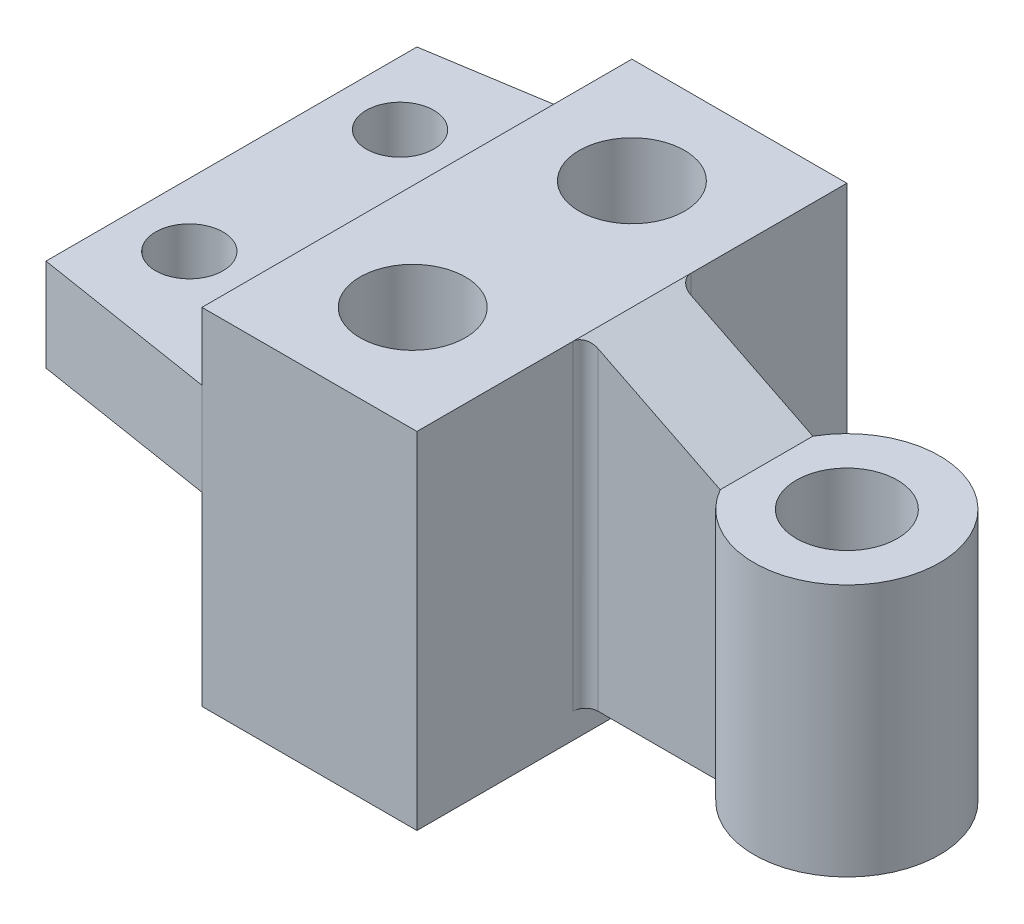
ISO-10303-21;
HEADER;
FILE_DESCRIPTION(('STEP AP214'),'2;1');
FILE_NAME('part.step','',(''),(''),'','','');
FILE_SCHEMA(('AUTOMOTIVE_DESIGN { 1 0 10303 214 1 1 1 1 }'));
ENDSEC;
DATA;
#1=APPLICATION_CONTEXT('core data for automotive mechanical design processes');
#2=APPLICATION_PROTOCOL_DEFINITION('international standard','automotive_design',2000,#1);
#3=PRODUCT_CONTEXT('',#1,'mechanical');
#4=PRODUCT('Part','Part','',(#3));
#5=PRODUCT_RELATED_PRODUCT_CATEGORY('part','',(#4));
#6=PRODUCT_DEFINITION_FORMATION('','',#4);
#7=PRODUCT_DEFINITION_CONTEXT('part definition',#1,'design');
#8=PRODUCT_DEFINITION('design','',#6,#7);
#9=PRODUCT_DEFINITION_SHAPE('','',#8);
#10=(LENGTH_UNIT() NAMED_UNIT(*) SI_UNIT(.MILLI.,.METRE.));
#11=(NAMED_UNIT(*) PLANE_ANGLE_UNIT() SI_UNIT($,.RADIAN.));
#12=(NAMED_UNIT(*) SI_UNIT($,.STERADIAN.) SOLID_ANGLE_UNIT());
#13=UNCERTAINTY_MEASURE_WITH_UNIT(LENGTH_MEASURE(1.E-05),#10,'distance_accuracy_value','');
#14=(GEOMETRIC_REPRESENTATION_CONTEXT(3) GLOBAL_UNCERTAINTY_ASSIGNED_CONTEXT((#13)) GLOBAL_UNIT_ASSIGNED_CONTEXT((#10,
#11,#12)) REPRESENTATION_CONTEXT('',''));
#15=CARTESIAN_POINT('',(0.,0.,0.));
#16=DIRECTION('',(0.,0.,1.));
#17=DIRECTION('',(1.,0.,0.));
#18=AXIS2_PLACEMENT_3D('',#15,#16,#17);
#19=CARTESIAN_POINT('',(-25.,82.,0.));
#20=DIRECTION('',(1.,0.,0.));
#21=DIRECTION('',(0.,0.,-1.));
#22=AXIS2_PLACEMENT_3D('',#19,#20,#21);
#23=PLANE('',#22);
#24=DIRECTION('',(0.,0.,1.));
#25=VECTOR('',#24,1.);
#26=CARTESIAN_POINT('',(-25.,44.,51.));
#27=LINE('',#26,#25);
#28=CARTESIAN_POINT('',(-25.,44.,-51.));
#29=VERTEX_POINT('',#28);
#30=CARTESIAN_POINT('',(-25.,44.,51.));
#31=VERTEX_POINT('',#30);
#32=EDGE_CURVE('E164',#29,#31,#27,.T.);
#33=ORIENTED_EDGE('',*,*,#32,.F.);
#34=DIRECTION('',(0.,-1.,0.));
#35=VECTOR('',#34,1.);
#36=CARTESIAN_POINT('',(-25.,82.,-51.));
#37=LINE('',#36,#35);
#38=CARTESIAN_POINT('',(-25.,0.,-51.));
#39=VERTEX_POINT('',#38);
#40=EDGE_CURVE('E171',#29,#39,#37,.T.);
#41=ORIENTED_EDGE('',*,*,#40,.T.);
#42=DIRECTION('',(0.,0.,1.));
#43=VECTOR('',#42,1.);
#44=CARTESIAN_POINT('',(-25.,0.,0.));
#45=LINE('',#44,#43);
#46=CARTESIAN_POINT('',(-25.,0.,51.));
#47=VERTEX_POINT('',#46);
#48=EDGE_CURVE('E246',#39,#47,#45,.T.);
#49=ORIENTED_EDGE('',*,*,#48,.T.);
#50=DIRECTION('',(0.,-1.,0.));
#51=VECTOR('',#50,1.);
#52=CARTESIAN_POINT('',(-25.,82.,51.));
#53=LINE('',#52,#51);
#54=EDGE_CURVE('E172',#31,#47,#53,.T.);
#55=ORIENTED_EDGE('',*,*,#54,.F.);
#56=EDGE_LOOP('',(#33,#41,#49,#55));
#57=FACE_BOUND('',#56,.T.);
#58=ADVANCED_FACE('F37',(#57),#23,.F.);
#59=DIRECTION('',(0.,0.,-1.));
#60=VECTOR('',#59,1.);
#61=CARTESIAN_POINT('',(-25.,66.,51.));
#62=LINE('',#61,#60);
#63=CARTESIAN_POINT('',(-25.,66.,51.));
#64=VERTEX_POINT('',#63);
#65=CARTESIAN_POINT('',(-25.,66.,-51.));
#66=VERTEX_POINT('',#65);
#67=EDGE_CURVE('E151',#64,#66,#62,.T.);
#68=ORIENTED_EDGE('',*,*,#67,.F.);
#69=CARTESIAN_POINT('',(-25.,82.,51.));
#70=VERTEX_POINT('',#69);
#71=EDGE_CURVE('E161',#70,#64,#53,.T.);
#72=ORIENTED_EDGE('',*,*,#71,.F.);
#73=DIRECTION('',(0.,0.,1.));
#74=VECTOR('',#73,1.);
#75=CARTESIAN_POINT('',(-25.,82.,0.));
#76=LINE('',#75,#74);
#77=CARTESIAN_POINT('',(-25.,82.,-51.));
#78=VERTEX_POINT('',#77);
#79=EDGE_CURVE('E240',#78,#70,#76,.T.);
#80=ORIENTED_EDGE('',*,*,#79,.F.);
#81=EDGE_CURVE('E163',#78,#66,#37,.T.);
#82=ORIENTED_EDGE('',*,*,#81,.T.);
#83=EDGE_LOOP('',(#68,#72,#80,#82));
#84=FACE_BOUND('',#83,.T.);
#85=ADVANCED_FACE('F159',(#84),#23,.F.);
#86=CARTESIAN_POINT('',(0.,82.,11.));
#87=DIRECTION('',(0.,0.,-1.));
#88=DIRECTION('',(-1.,0.,0.));
#89=AXIS2_PLACEMENT_3D('',#86,#87,#88);
#90=PLANE('',#89);
#91=DIRECTION('',(-0.894132797864661,0.447801897922188,0.));
#92=VECTOR('',#91,1.);
#93=CARTESIAN_POINT('',(57.9474411167423,66.,11.));
#94=LINE('',#93,#92);
#95=CARTESIAN_POINT('',(57.9474411167423,66.,11.));
#96=VERTEX_POINT('',#95);
#97=CARTESIAN_POINT('',(29.,80.4975322491527,11.));
#98=VERTEX_POINT('',#97);
#99=EDGE_CURVE('E288',#96,#98,#94,.T.);
#100=ORIENTED_EDGE('',*,*,#99,.T.);
#101=DIRECTION('',(0.,-1.,0.));
#102=VECTOR('',#101,1.);
#103=CARTESIAN_POINT('',(29.,82.,11.));
#104=LINE('',#103,#102);
#105=CARTESIAN_POINT('',(29.,6.00000000000001,11.));
#106=VERTEX_POINT('',#105);
#107=EDGE_CURVE('E205',#98,#106,#104,.T.);
#108=ORIENTED_EDGE('',*,*,#107,.T.);
#109=DIRECTION('',(-1.,0.,0.));
#110=VECTOR('',#109,1.);
#111=CARTESIAN_POINT('',(0.,6.00000000000001,11.));
#112=LINE('',#111,#110);
#113=CARTESIAN_POINT('',(57.9474411167423,6.00000000000001,11.));
#114=VERTEX_POINT('',#113);
#115=EDGE_CURVE('E216',#114,#106,#112,.T.);
#116=ORIENTED_EDGE('',*,*,#115,.F.);
#117=DIRECTION('',(0.,-1.,0.));
#118=VECTOR('',#117,1.);
#119=CARTESIAN_POINT('',(57.9474411167423,82.,11.));
#120=LINE('',#119,#118);
#121=EDGE_CURVE('E184',#96,#114,#120,.T.);
#122=ORIENTED_EDGE('',*,*,#121,.F.);
#123=EDGE_LOOP('',(#100,#108,#116,#122));
#124=FACE_BOUND('',#123,.T.);
#125=ADVANCED_FACE('F337',(#124),#90,.F.);
#126=CARTESIAN_POINT('',(77.,82.,0.));
#127=DIRECTION('',(0.,-1.,0.));
#128=DIRECTION('',(0.,0.,-1.));
#129=AXIS2_PLACEMENT_3D('',#126,#127,#128);
#130=CYLINDRICAL_SURFACE('',#129,22.);
#131=CARTESIAN_POINT('',(77.,66.,0.));
#132=DIRECTION('',(0.,1.,0.));
#133=DIRECTION('',(0.,0.,1.));
#134=AXIS2_PLACEMENT_3D('',#131,#132,#133);
#135=CIRCLE('',#134,22.);
#136=CARTESIAN_POINT('',(57.9474411167423,66.,-11.));
#137=VERTEX_POINT('',#136);
#138=EDGE_CURVE('E280',#96,#137,#135,.T.);
#139=ORIENTED_EDGE('',*,*,#138,.F.);
#140=ORIENTED_EDGE('',*,*,#121,.T.);
#141=CARTESIAN_POINT('',(77.,6.00000000000001,0.));
#142=DIRECTION('',(0.,-1.,0.));
#143=DIRECTION('',(0.,0.,-1.));
#144=AXIS2_PLACEMENT_3D('',#141,#142,#143);
#145=CIRCLE('',#144,22.);
#146=CARTESIAN_POINT('',(57.9474411167423,6.00000000000001,-11.));
#147=VERTEX_POINT('',#146);
#148=EDGE_CURVE('E278',#147,#114,#145,.T.);
#149=ORIENTED_EDGE('',*,*,#148,.F.);
#150=DIRECTION('',(0.,-1.,0.));
#151=VECTOR('',#150,1.);
#152=CARTESIAN_POINT('',(57.9474411167423,82.,-11.));
#153=LINE('',#152,#151);
#154=EDGE_CURVE('E182',#137,#147,#153,.T.);
#155=ORIENTED_EDGE('',*,*,#154,.F.);
#156=EDGE_LOOP('',(#139,#140,#149,#155));
#157=FACE_BOUND('',#156,.T.);
#158=ADVANCED_FACE('F339',(#157),#130,.T.);
#159=CARTESIAN_POINT('',(0.,82.,-11.));
#160=DIRECTION('',(0.,0.,-1.));
#161=DIRECTION('',(-1.,0.,0.));
#162=AXIS2_PLACEMENT_3D('',#159,#160,#161);
#163=PLANE('',#162);
#164=DIRECTION('',(-1.,0.,0.));
#165=VECTOR('',#164,1.);
#166=CARTESIAN_POINT('',(0.,6.00000000000001,-11.));
#167=LINE('',#166,#165);
#168=CARTESIAN_POINT('',(29.,6.00000000000001,-11.));
#169=VERTEX_POINT('',#168);
#170=EDGE_CURVE('E273',#147,#169,#167,.T.);
#171=ORIENTED_EDGE('',*,*,#170,.T.);
#172=DIRECTION('',(0.,-1.,0.));
#173=VECTOR('',#172,1.);
#174=CARTESIAN_POINT('',(29.,82.,-11.));
#175=LINE('',#174,#173);
#176=CARTESIAN_POINT('',(29.,80.4975322491527,-11.));
#177=VERTEX_POINT('',#176);
#178=EDGE_CURVE('E198',#169,#177,#175,.F.);
#179=ORIENTED_EDGE('',*,*,#178,.T.);
#180=DIRECTION('',(-0.894132797864661,0.447801897922188,0.));
#181=VECTOR('',#180,1.);
#182=CARTESIAN_POINT('',(57.9474411167423,66.,-11.));
#183=LINE('',#182,#181);
#184=EDGE_CURVE('E267',#137,#177,#183,.T.);
#185=ORIENTED_EDGE('',*,*,#184,.F.);
#186=ORIENTED_EDGE('',*,*,#154,.T.);
#187=EDGE_LOOP('',(#171,#179,#185,#186));
#188=FACE_BOUND('',#187,.T.);
#189=ADVANCED_FACE('F276',(#188),#163,.T.);
#190=CARTESIAN_POINT('',(0.,82.,-51.));
#191=DIRECTION('',(0.,0.,-1.));
#192=DIRECTION('',(-1.,0.,0.));
#193=AXIS2_PLACEMENT_3D('',#190,#191,#192);
#194=PLANE('',#193);
#195=DIRECTION('',(0.,1.,0.));
#196=VECTOR('',#195,1.);
#197=CARTESIAN_POINT('',(-25.,0.,-51.));
#198=LINE('',#197,#196);
#199=EDGE_CURVE('E304',#29,#66,#198,.T.);
#200=ORIENTED_EDGE('',*,*,#199,.T.);
#201=ORIENTED_EDGE('',*,*,#81,.F.);
#202=DIRECTION('',(1.,0.,0.));
#203=VECTOR('',#202,1.);
#204=CARTESIAN_POINT('',(0.,82.,-51.));
#205=LINE('',#204,#203);
#206=CARTESIAN_POINT('',(26.,82.,-51.));
#207=VERTEX_POINT('',#206);
#208=EDGE_CURVE('E232',#78,#207,#205,.T.);
#209=ORIENTED_EDGE('',*,*,#208,.T.);
#210=DIRECTION('',(0.,-1.,0.));
#211=VECTOR('',#210,1.);
#212=CARTESIAN_POINT('',(26.,82.,-51.));
#213=LINE('',#212,#211);
#214=CARTESIAN_POINT('',(26.,0.,-51.));
#215=VERTEX_POINT('',#214);
#216=EDGE_CURVE('E179',#207,#215,#213,.T.);
#217=ORIENTED_EDGE('',*,*,#216,.T.);
#218=DIRECTION('',(1.,0.,0.));
#219=VECTOR('',#218,1.);
#220=CARTESIAN_POINT('',(0.,0.,-51.));
#221=LINE('',#220,#219);
#222=EDGE_CURVE('E243',#39,#215,#221,.T.);
#223=ORIENTED_EDGE('',*,*,#222,.F.);
#224=ORIENTED_EDGE('',*,*,#40,.F.);
#225=EDGE_LOOP('',(#200,#201,#209,#217,#223,#224));
#226=FACE_BOUND('',#225,.T.);
#227=ADVANCED_FACE('F256',(#226),#194,.T.);
#228=CARTESIAN_POINT('',(0.,82.,51.));
#229=DIRECTION('',(0.,0.,-1.));
#230=DIRECTION('',(-1.,0.,0.));
#231=AXIS2_PLACEMENT_3D('',#228,#229,#230);
#232=PLANE('',#231);
#233=ORIENTED_EDGE('',*,*,#71,.T.);
#234=DIRECTION('',(0.,1.,0.));
#235=VECTOR('',#234,1.);
#236=CARTESIAN_POINT('',(-25.,0.,51.));
#237=LINE('',#236,#235);
#238=EDGE_CURVE('E133',#31,#64,#237,.T.);
#239=ORIENTED_EDGE('',*,*,#238,.F.);
#240=ORIENTED_EDGE('',*,*,#54,.T.);
#241=DIRECTION('',(1.,0.,0.));
#242=VECTOR('',#241,1.);
#243=CARTESIAN_POINT('',(0.,0.,51.));
#244=LINE('',#243,#242);
#245=CARTESIAN_POINT('',(26.,0.,51.));
#246=VERTEX_POINT('',#245);
#247=EDGE_CURVE('E233',#47,#246,#244,.T.);
#248=ORIENTED_EDGE('',*,*,#247,.T.);
#249=DIRECTION('',(0.,-1.,0.));
#250=VECTOR('',#249,1.);
#251=CARTESIAN_POINT('',(26.,82.,51.));
#252=LINE('',#251,#250);
#253=CARTESIAN_POINT('',(26.,82.,51.));
#254=VERTEX_POINT('',#253);
#255=EDGE_CURVE('E175',#254,#246,#252,.T.);
#256=ORIENTED_EDGE('',*,*,#255,.F.);
#257=DIRECTION('',(1.,0.,0.));
#258=VECTOR('',#257,1.);
#259=CARTESIAN_POINT('',(0.,82.,51.));
#260=LINE('',#259,#258);
#261=EDGE_CURVE('E170',#70,#254,#260,.T.);
#262=ORIENTED_EDGE('',*,*,#261,.F.);
#263=EDGE_LOOP('',(#233,#239,#240,#248,#256,#262));
#264=FACE_BOUND('',#263,.T.);
#265=ADVANCED_FACE('F167',(#264),#232,.F.);
#266=CARTESIAN_POINT('',(26.,82.,0.));
#267=DIRECTION('',(1.,0.,0.));
#268=DIRECTION('',(0.,0.,-1.));
#269=AXIS2_PLACEMENT_3D('',#266,#267,#268);
#270=PLANE('',#269);
#271=DIRECTION('',(0.,0.,-1.));
#272=VECTOR('',#271,1.);
#273=CARTESIAN_POINT('',(26.,6.,30.1339669686627));
#274=LINE('',#273,#272);
#275=CARTESIAN_POINT('',(26.,6.,14.));
#276=VERTEX_POINT('',#275);
#277=CARTESIAN_POINT('',(26.,6.,-14.));
#278=VERTEX_POINT('',#277);
#279=EDGE_CURVE('E52',#276,#278,#274,.T.);
#280=ORIENTED_EDGE('',*,*,#279,.F.);
#281=DIRECTION('',(0.,-1.,0.));
#282=VECTOR('',#281,1.);
#283=CARTESIAN_POINT('',(26.,82.,14.));
#284=LINE('',#283,#282);
#285=CARTESIAN_POINT('',(26.,82.,14.));
#286=VERTEX_POINT('',#285);
#287=EDGE_CURVE('E208',#276,#286,#284,.F.);
#288=ORIENTED_EDGE('',*,*,#287,.T.);
#289=DIRECTION('',(0.,0.,1.));
#290=VECTOR('',#289,1.);
#291=CARTESIAN_POINT('',(26.,82.,0.));
#292=LINE('',#291,#290);
#293=EDGE_CURVE('E223',#286,#254,#292,.T.);
#294=ORIENTED_EDGE('',*,*,#293,.T.);
#295=ORIENTED_EDGE('',*,*,#255,.T.);
#296=DIRECTION('',(0.,0.,1.));
#297=VECTOR('',#296,1.);
#298=CARTESIAN_POINT('',(26.,0.,0.));
#299=LINE('',#298,#297);
#300=EDGE_CURVE('E230',#215,#246,#299,.T.);
#301=ORIENTED_EDGE('',*,*,#300,.F.);
#302=ORIENTED_EDGE('',*,*,#216,.F.);
#303=CARTESIAN_POINT('',(26.,82.,-14.));
#304=VERTEX_POINT('',#303);
#305=EDGE_CURVE('E229',#207,#304,#292,.T.);
#306=ORIENTED_EDGE('',*,*,#305,.T.);
#307=DIRECTION('',(0.,-1.,0.));
#308=VECTOR('',#307,1.);
#309=CARTESIAN_POINT('',(26.,6.00000000000001,-14.));
#310=LINE('',#309,#308);
#311=EDGE_CURVE('E191',#304,#278,#310,.T.);
#312=ORIENTED_EDGE('',*,*,#311,.T.);
#313=EDGE_LOOP('',(#280,#288,#294,#295,#301,#302,#306,#312));
#314=FACE_BOUND('',#313,.T.);
#315=ADVANCED_FACE('F221',(#314),#270,.T.);
#316=CARTESIAN_POINT('',(0.,82.,0.));
#317=DIRECTION('',(0.,1.,0.));
#318=DIRECTION('',(0.,0.,1.));
#319=AXIS2_PLACEMENT_3D('',#316,#317,#318);
#320=PLANE('',#319);
#321=CARTESIAN_POINT('',(0.,82.,26.));
#322=DIRECTION('',(0.,1.,0.));
#323=DIRECTION('',(0.,0.,1.));
#324=AXIS2_PLACEMENT_3D('',#321,#322,#323);
#325=CIRCLE('',#324,12.5);
#326=CARTESIAN_POINT('',(0.,82.,38.5));
#327=VERTEX_POINT('',#326);
#328=EDGE_CURVE('E318',#327,#327,#325,.T.);
#329=ORIENTED_EDGE('',*,*,#328,.F.);
#330=EDGE_LOOP('',(#329));
#331=FACE_BOUND('',#330,.T.);
#332=CARTESIAN_POINT('',(0.,82.,-26.));
#333=DIRECTION('',(0.,1.,0.));
#334=DIRECTION('',(0.,0.,1.));
#335=AXIS2_PLACEMENT_3D('',#332,#333,#334);
#336=CIRCLE('',#335,12.5);
#337=CARTESIAN_POINT('',(0.,82.,-13.5));
#338=VERTEX_POINT('',#337);
#339=EDGE_CURVE('E314',#338,#338,#336,.T.);
#340=ORIENTED_EDGE('',*,*,#339,.F.);
#341=EDGE_LOOP('',(#340));
#342=FACE_BOUND('',#341,.T.);
#343=ORIENTED_EDGE('',*,*,#261,.T.);
#344=ORIENTED_EDGE('',*,*,#293,.F.);
#345=DIRECTION('',(0.,0.,1.));
#346=VECTOR('',#345,1.);
#347=CARTESIAN_POINT('',(26.,82.,-11.));
#348=LINE('',#347,#346);
#349=EDGE_CURVE('E227',#304,#286,#348,.T.);
#350=ORIENTED_EDGE('',*,*,#349,.F.);
#351=ORIENTED_EDGE('',*,*,#305,.F.);
#352=ORIENTED_EDGE('',*,*,#208,.F.);
#353=ORIENTED_EDGE('',*,*,#79,.T.);
#354=EDGE_LOOP('',(#343,#344,#350,#351,#352,#353));
#355=FACE_BOUND('',#354,.T.);
#356=ADVANCED_FACE('F225',(#331,#342,#355),#320,.T.);
#357=CARTESIAN_POINT('',(0.,0.,0.));
#358=DIRECTION('',(0.,1.,0.));
#359=DIRECTION('',(0.,0.,1.));
#360=AXIS2_PLACEMENT_3D('',#357,#358,#359);
#361=PLANE('',#360);
#362=CARTESIAN_POINT('',(0.,0.,26.));
#363=DIRECTION('',(0.,1.,0.));
#364=DIRECTION('',(0.,0.,1.));
#365=AXIS2_PLACEMENT_3D('',#362,#363,#364);
#366=CIRCLE('',#365,12.5);
#367=CARTESIAN_POINT('',(0.,0.,38.5));
#368=VERTEX_POINT('',#367);
#369=EDGE_CURVE('E309',#368,#368,#366,.T.);
#370=ORIENTED_EDGE('',*,*,#369,.T.);
#371=EDGE_LOOP('',(#370));
#372=FACE_BOUND('',#371,.T.);
#373=CARTESIAN_POINT('',(0.,0.,-26.));
#374=DIRECTION('',(0.,1.,0.));
#375=DIRECTION('',(0.,0.,1.));
#376=AXIS2_PLACEMENT_3D('',#373,#374,#375);
#377=CIRCLE('',#376,12.5);
#378=CARTESIAN_POINT('',(0.,0.,-13.5));
#379=VERTEX_POINT('',#378);
#380=EDGE_CURVE('E311',#379,#379,#377,.T.);
#381=ORIENTED_EDGE('',*,*,#380,.T.);
#382=EDGE_LOOP('',(#381));
#383=FACE_BOUND('',#382,.T.);
#384=ORIENTED_EDGE('',*,*,#222,.T.);
#385=ORIENTED_EDGE('',*,*,#300,.T.);
#386=ORIENTED_EDGE('',*,*,#247,.F.);
#387=ORIENTED_EDGE('',*,*,#48,.F.);
#388=EDGE_LOOP('',(#384,#385,#386,#387));
#389=FACE_BOUND('',#388,.T.);
#390=ADVANCED_FACE('F252',(#372,#383,#389),#361,.F.);
#391=CARTESIAN_POINT('',(0.,6.,0.));
#392=DIRECTION('',(0.,-1.,0.));
#393=DIRECTION('',(0.,0.,-1.));
#394=AXIS2_PLACEMENT_3D('',#391,#392,#393);
#395=PLANE('',#394);
#396=CARTESIAN_POINT('',(77.,6.,0.));
#397=DIRECTION('',(0.,-1.,0.));
#398=DIRECTION('',(0.,0.,-1.));
#399=AXIS2_PLACEMENT_3D('',#396,#397,#398);
#400=CIRCLE('',#399,12.);
#401=CARTESIAN_POINT('',(77.,6.,-12.));
#402=VERTEX_POINT('',#401);
#403=EDGE_CURVE('E315',#402,#402,#400,.T.);
#404=ORIENTED_EDGE('',*,*,#403,.F.);
#405=EDGE_LOOP('',(#404));
#406=FACE_BOUND('',#405,.T.);
#407=ORIENTED_EDGE('',*,*,#115,.T.);
#408=CARTESIAN_POINT('',(29.,6.00000000000001,14.));
#409=DIRECTION('',(0.,-1.,0.));
#410=DIRECTION('',(0.,0.,-1.));
#411=AXIS2_PLACEMENT_3D('',#408,#409,#410);
#412=CIRCLE('',#411,3.);
#413=EDGE_CURVE('E46',#106,#276,#412,.F.);
#414=ORIENTED_EDGE('',*,*,#413,.T.);
#415=ORIENTED_EDGE('',*,*,#279,.T.);
#416=CARTESIAN_POINT('',(29.,6.00000000000001,-14.));
#417=DIRECTION('',(0.,-1.,0.));
#418=DIRECTION('',(0.,0.,-1.));
#419=AXIS2_PLACEMENT_3D('',#416,#417,#418);
#420=CIRCLE('',#419,3.);
#421=EDGE_CURVE('E200',#278,#169,#420,.F.);
#422=ORIENTED_EDGE('',*,*,#421,.T.);
#423=ORIENTED_EDGE('',*,*,#170,.F.);
#424=ORIENTED_EDGE('',*,*,#148,.T.);
#425=EDGE_LOOP('',(#407,#414,#415,#422,#423,#424));
#426=FACE_BOUND('',#425,.T.);
#427=ADVANCED_FACE('F212',(#406,#426),#395,.T.);
#428=CARTESIAN_POINT('',(0.,66.,0.));
#429=DIRECTION('',(0.,1.,0.));
#430=DIRECTION('',(0.,0.,1.));
#431=AXIS2_PLACEMENT_3D('',#428,#429,#430);
#432=PLANE('',#431);
#433=CARTESIAN_POINT('',(77.,66.,0.));
#434=DIRECTION('',(0.,1.,0.));
#435=DIRECTION('',(0.,0.,1.));
#436=AXIS2_PLACEMENT_3D('',#433,#434,#435);
#437=CIRCLE('',#436,12.);
#438=CARTESIAN_POINT('',(77.,66.,12.));
#439=VERTEX_POINT('',#438);
#440=EDGE_CURVE('E325',#439,#439,#437,.T.);
#441=ORIENTED_EDGE('',*,*,#440,.F.);
#442=EDGE_LOOP('',(#441));
#443=FACE_BOUND('',#442,.T.);
#444=DIRECTION('',(0.,0.,1.));
#445=VECTOR('',#444,1.);
#446=CARTESIAN_POINT('',(57.9474411167423,66.,-11.));
#447=LINE('',#446,#445);
#448=EDGE_CURVE('E284',#137,#96,#447,.T.);
#449=ORIENTED_EDGE('',*,*,#448,.T.);
#450=ORIENTED_EDGE('',*,*,#138,.T.);
#451=EDGE_LOOP('',(#449,#450));
#452=FACE_BOUND('',#451,.T.);
#453=ADVANCED_FACE('F331',(#443,#452),#432,.T.);
#454=CARTESIAN_POINT('',(57.9474411167423,66.,-11.));
#455=DIRECTION('',(0.447801897922188,0.894132797864661,0.));
#456=DIRECTION('',(-0.894132797864661,0.447801897922188,0.));
#457=AXIS2_PLACEMENT_3D('',#454,#455,#456);
#458=PLANE('',#457);
#459=ORIENTED_EDGE('',*,*,#99,.F.);
#460=ORIENTED_EDGE('',*,*,#448,.F.);
#461=ORIENTED_EDGE('',*,*,#184,.T.);
#462=CARTESIAN_POINT('',(29.,80.4975322491527,-14.));
#463=DIRECTION('',(0.447801897922188,0.894132797864661,0.));
#464=DIRECTION('',(-0.894132797864661,0.447801897922188,0.));
#465=AXIS2_PLACEMENT_3D('',#462,#463,#464);
#466=ELLIPSE('',#465,3.35520630399031,3.);
#467=EDGE_CURVE('E202',#177,#304,#466,.F.);
#468=ORIENTED_EDGE('',*,*,#467,.T.);
#469=ORIENTED_EDGE('',*,*,#349,.T.);
#470=CARTESIAN_POINT('',(29.,80.4975322491527,14.));
#471=DIRECTION('',(0.447801897922188,0.894132797864661,0.));
#472=DIRECTION('',(0.894132797864661,-0.447801897922188,0.));
#473=AXIS2_PLACEMENT_3D('',#470,#471,#472);
#474=ELLIPSE('',#473,3.35520630399031,3.);
#475=EDGE_CURVE('E11',#286,#98,#474,.F.);
#476=ORIENTED_EDGE('',*,*,#475,.T.);
#477=EDGE_LOOP('',(#459,#460,#461,#468,#469,#476));
#478=FACE_BOUND('',#477,.T.);
#479=ADVANCED_FACE('F264',(#478),#458,.T.);
#480=CARTESIAN_POINT('',(-69.,66.,51.));
#481=DIRECTION('',(0.,-1.,0.));
#482=DIRECTION('',(0.,0.,-1.));
#483=AXIS2_PLACEMENT_3D('',#480,#481,#482);
#484=PLANE('',#483);
#485=CARTESIAN_POINT('',(-54.,66.,-25.));
#486=DIRECTION('',(0.,1.,0.));
#487=DIRECTION('',(0.,0.,1.));
#488=AXIS2_PLACEMENT_3D('',#485,#486,#487);
#489=CIRCLE('',#488,8.);
#490=CARTESIAN_POINT('',(-54.,66.,-17.));
#491=VERTEX_POINT('',#490);
#492=EDGE_CURVE('E305',#491,#491,#489,.T.);
#493=ORIENTED_EDGE('',*,*,#492,.F.);
#494=EDGE_LOOP('',(#493));
#495=FACE_BOUND('',#494,.T.);
#496=CARTESIAN_POINT('',(-54.,66.,25.));
#497=DIRECTION('',(0.,1.,0.));
#498=DIRECTION('',(0.,0.,1.));
#499=AXIS2_PLACEMENT_3D('',#496,#497,#498);
#500=CIRCLE('',#499,8.);
#501=CARTESIAN_POINT('',(-54.,66.,33.));
#502=VERTEX_POINT('',#501);
#503=EDGE_CURVE('E301',#502,#502,#500,.T.);
#504=ORIENTED_EDGE('',*,*,#503,.F.);
#505=EDGE_LOOP('',(#504));
#506=FACE_BOUND('',#505,.T.);
#507=DIRECTION('',(0.,0.,-1.));
#508=VECTOR('',#507,1.);
#509=CARTESIAN_POINT('',(-69.,66.,51.));
#510=LINE('',#509,#508);
#511=CARTESIAN_POINT('',(-69.,66.,44.));
#512=VERTEX_POINT('',#511);
#513=CARTESIAN_POINT('',(-69.,66.,-44.));
#514=VERTEX_POINT('',#513);
#515=EDGE_CURVE('E153',#512,#514,#510,.T.);
#516=ORIENTED_EDGE('',*,*,#515,.F.);
#517=DIRECTION('',(-0.987580306335114,0.,-0.157115048735132));
#518=VECTOR('',#517,1.);
#519=CARTESIAN_POINT('',(-25.,66.,51.));
#520=LINE('',#519,#518);
#521=EDGE_CURVE('E136',#64,#512,#520,.T.);
#522=ORIENTED_EDGE('',*,*,#521,.F.);
#523=ORIENTED_EDGE('',*,*,#67,.T.);
#524=DIRECTION('',(0.987580306335114,0.,-0.157115048735132));
#525=VECTOR('',#524,1.);
#526=CARTESIAN_POINT('',(-25.,66.,-51.));
#527=LINE('',#526,#525);
#528=EDGE_CURVE('E154',#514,#66,#527,.T.);
#529=ORIENTED_EDGE('',*,*,#528,.F.);
#530=EDGE_LOOP('',(#516,#522,#523,#529));
#531=FACE_BOUND('',#530,.T.);
#532=ADVANCED_FACE('F149',(#495,#506,#531),#484,.F.);
#533=CARTESIAN_POINT('',(-69.,44.,51.));
#534=DIRECTION('',(0.,1.,0.));
#535=DIRECTION('',(0.,0.,1.));
#536=AXIS2_PLACEMENT_3D('',#533,#534,#535);
#537=PLANE('',#536);
#538=CARTESIAN_POINT('',(-54.,44.,-25.));
#539=DIRECTION('',(0.,1.,0.));
#540=DIRECTION('',(0.,0.,1.));
#541=AXIS2_PLACEMENT_3D('',#538,#539,#540);
#542=CIRCLE('',#541,8.);
#543=CARTESIAN_POINT('',(-54.,44.,-17.));
#544=VERTEX_POINT('',#543);
#545=EDGE_CURVE('E165',#544,#544,#542,.T.);
#546=ORIENTED_EDGE('',*,*,#545,.T.);
#547=EDGE_LOOP('',(#546));
#548=FACE_BOUND('',#547,.T.);
#549=CARTESIAN_POINT('',(-54.,44.,25.));
#550=DIRECTION('',(0.,1.,0.));
#551=DIRECTION('',(0.,0.,1.));
#552=AXIS2_PLACEMENT_3D('',#549,#550,#551);
#553=CIRCLE('',#552,8.);
#554=CARTESIAN_POINT('',(-54.,44.,33.));
#555=VERTEX_POINT('',#554);
#556=EDGE_CURVE('E192',#555,#555,#553,.T.);
#557=ORIENTED_EDGE('',*,*,#556,.T.);
#558=EDGE_LOOP('',(#557));
#559=FACE_BOUND('',#558,.T.);
#560=ORIENTED_EDGE('',*,*,#32,.T.);
#561=DIRECTION('',(-0.987580306335114,0.,-0.157115048735132));
#562=VECTOR('',#561,1.);
#563=CARTESIAN_POINT('',(-67.9138539042821,44.,44.1727959697733));
#564=LINE('',#563,#562);
#565=CARTESIAN_POINT('',(-69.,44.,44.));
#566=VERTEX_POINT('',#565);
#567=EDGE_CURVE('E139',#31,#566,#564,.T.);
#568=ORIENTED_EDGE('',*,*,#567,.T.);
#569=DIRECTION('',(0.,0.,1.));
#570=VECTOR('',#569,1.);
#571=CARTESIAN_POINT('',(-69.,44.,51.));
#572=LINE('',#571,#570);
#573=CARTESIAN_POINT('',(-69.,44.,-44.));
#574=VERTEX_POINT('',#573);
#575=EDGE_CURVE('E291',#574,#566,#572,.T.);
#576=ORIENTED_EDGE('',*,*,#575,.F.);
#577=DIRECTION('',(0.987580306335114,0.,-0.157115048735132));
#578=VECTOR('',#577,1.);
#579=CARTESIAN_POINT('',(-83.7405541561713,44.,-41.6549118387909));
#580=LINE('',#579,#578);
#581=EDGE_CURVE('E143',#574,#29,#580,.T.);
#582=ORIENTED_EDGE('',*,*,#581,.T.);
#583=EDGE_LOOP('',(#560,#568,#576,#582));
#584=FACE_BOUND('',#583,.T.);
#585=ADVANCED_FACE('F381',(#548,#559,#584),#537,.F.);
#586=CARTESIAN_POINT('',(-69.,0.,0.));
#587=DIRECTION('',(1.,0.,0.));
#588=DIRECTION('',(0.,0.,-1.));
#589=AXIS2_PLACEMENT_3D('',#586,#587,#588);
#590=PLANE('',#589);
#591=ORIENTED_EDGE('',*,*,#575,.T.);
#592=DIRECTION('',(0.,1.,0.));
#593=VECTOR('',#592,1.);
#594=CARTESIAN_POINT('',(-69.,0.,44.));
#595=LINE('',#594,#593);
#596=EDGE_CURVE('E189',#566,#512,#595,.T.);
#597=ORIENTED_EDGE('',*,*,#596,.T.);
#598=ORIENTED_EDGE('',*,*,#515,.T.);
#599=DIRECTION('',(0.,-1.,0.));
#600=VECTOR('',#599,1.);
#601=CARTESIAN_POINT('',(-69.,0.,-44.));
#602=LINE('',#601,#600);
#603=EDGE_CURVE('E186',#514,#574,#602,.T.);
#604=ORIENTED_EDGE('',*,*,#603,.T.);
#605=EDGE_LOOP('',(#591,#597,#598,#604));
#606=FACE_BOUND('',#605,.T.);
#607=ADVANCED_FACE('F385',(#606),#590,.F.);
#608=CARTESIAN_POINT('',(-25.,0.,-51.));
#609=DIRECTION('',(0.157115048735132,0.,0.987580306335114));
#610=DIRECTION('',(0.987580306335114,0.,-0.157115048735132));
#611=AXIS2_PLACEMENT_3D('',#608,#609,#610);
#612=PLANE('',#611);
#613=ORIENTED_EDGE('',*,*,#603,.F.);
#614=ORIENTED_EDGE('',*,*,#528,.T.);
#615=ORIENTED_EDGE('',*,*,#199,.F.);
#616=ORIENTED_EDGE('',*,*,#581,.F.);
#617=EDGE_LOOP('',(#613,#614,#615,#616));
#618=FACE_BOUND('',#617,.T.);
#619=ADVANCED_FACE('F389',(#618),#612,.F.);
#620=CARTESIAN_POINT('',(-25.,0.,51.));
#621=DIRECTION('',(0.157115048735132,0.,-0.987580306335114));
#622=DIRECTION('',(-0.987580306335114,0.,-0.157115048735132));
#623=AXIS2_PLACEMENT_3D('',#620,#621,#622);
#624=PLANE('',#623);
#625=ORIENTED_EDGE('',*,*,#238,.T.);
#626=ORIENTED_EDGE('',*,*,#521,.T.);
#627=ORIENTED_EDGE('',*,*,#596,.F.);
#628=ORIENTED_EDGE('',*,*,#567,.F.);
#629=EDGE_LOOP('',(#625,#626,#627,#628));
#630=FACE_BOUND('',#629,.T.);
#631=ADVANCED_FACE('F135',(#630),#624,.F.);
#632=CARTESIAN_POINT('',(-54.,0.,25.));
#633=DIRECTION('',(0.,1.,0.));
#634=DIRECTION('',(0.,0.,1.));
#635=AXIS2_PLACEMENT_3D('',#632,#633,#634);
#636=CYLINDRICAL_SURFACE('',#635,8.);
#637=ORIENTED_EDGE('',*,*,#503,.T.);
#638=EDGE_LOOP('',(#637));
#639=FACE_BOUND('',#638,.T.);
#640=ORIENTED_EDGE('',*,*,#556,.F.);
#641=EDGE_LOOP('',(#640));
#642=FACE_BOUND('',#641,.T.);
#643=ADVANCED_FACE('F391',(#639,#642),#636,.F.);
#644=CARTESIAN_POINT('',(-54.,0.,-25.));
#645=DIRECTION('',(0.,1.,0.));
#646=DIRECTION('',(0.,0.,1.));
#647=AXIS2_PLACEMENT_3D('',#644,#645,#646);
#648=CYLINDRICAL_SURFACE('',#647,8.);
#649=ORIENTED_EDGE('',*,*,#492,.T.);
#650=EDGE_LOOP('',(#649));
#651=FACE_BOUND('',#650,.T.);
#652=ORIENTED_EDGE('',*,*,#545,.F.);
#653=EDGE_LOOP('',(#652));
#654=FACE_BOUND('',#653,.T.);
#655=ADVANCED_FACE('F394',(#651,#654),#648,.F.);
#656=CARTESIAN_POINT('',(0.,0.,-26.));
#657=DIRECTION('',(0.,1.,0.));
#658=DIRECTION('',(0.,0.,1.));
#659=AXIS2_PLACEMENT_3D('',#656,#657,#658);
#660=CYLINDRICAL_SURFACE('',#659,12.5);
#661=ORIENTED_EDGE('',*,*,#380,.F.);
#662=EDGE_LOOP('',(#661));
#663=FACE_BOUND('',#662,.T.);
#664=ORIENTED_EDGE('',*,*,#339,.T.);
#665=EDGE_LOOP('',(#664));
#666=FACE_BOUND('',#665,.T.);
#667=ADVANCED_FACE('F401',(#663,#666),#660,.F.);
#668=CARTESIAN_POINT('',(0.,0.,26.));
#669=DIRECTION('',(0.,1.,0.));
#670=DIRECTION('',(0.,0.,1.));
#671=AXIS2_PLACEMENT_3D('',#668,#669,#670);
#672=CYLINDRICAL_SURFACE('',#671,12.5);
#673=ORIENTED_EDGE('',*,*,#369,.F.);
#674=EDGE_LOOP('',(#673));
#675=FACE_BOUND('',#674,.T.);
#676=ORIENTED_EDGE('',*,*,#328,.T.);
#677=EDGE_LOOP('',(#676));
#678=FACE_BOUND('',#677,.T.);
#679=ADVANCED_FACE('F407',(#675,#678),#672,.F.);
#680=CARTESIAN_POINT('',(77.,0.,0.));
#681=DIRECTION('',(0.,1.,0.));
#682=DIRECTION('',(0.,0.,1.));
#683=AXIS2_PLACEMENT_3D('',#680,#681,#682);
#684=CYLINDRICAL_SURFACE('',#683,12.);
#685=ORIENTED_EDGE('',*,*,#403,.T.);
#686=EDGE_LOOP('',(#685));
#687=FACE_BOUND('',#686,.T.);
#688=ORIENTED_EDGE('',*,*,#440,.T.);
#689=EDGE_LOOP('',(#688));
#690=FACE_BOUND('',#689,.T.);
#691=ADVANCED_FACE('F329',(#687,#690),#684,.F.);
#692=CARTESIAN_POINT('',(29.,82.,-14.));
#693=DIRECTION('',(0.,1.,0.));
#694=DIRECTION('',(0.,0.,1.));
#695=AXIS2_PLACEMENT_3D('',#692,#693,#694);
#696=CYLINDRICAL_SURFACE('',#695,3.);
#697=ORIENTED_EDGE('',*,*,#467,.F.);
#698=ORIENTED_EDGE('',*,*,#178,.F.);
#699=ORIENTED_EDGE('',*,*,#421,.F.);
#700=ORIENTED_EDGE('',*,*,#311,.F.);
#701=EDGE_LOOP('',(#697,#698,#699,#700));
#702=FACE_BOUND('',#701,.T.);
#703=ADVANCED_FACE('F270',(#702),#696,.F.);
#704=CARTESIAN_POINT('',(29.,82.,14.));
#705=DIRECTION('',(0.,-1.,0.));
#706=DIRECTION('',(0.,0.,-1.));
#707=AXIS2_PLACEMENT_3D('',#704,#705,#706);
#708=CYLINDRICAL_SURFACE('',#707,3.);
#709=ORIENTED_EDGE('',*,*,#475,.F.);
#710=ORIENTED_EDGE('',*,*,#287,.F.);
#711=ORIENTED_EDGE('',*,*,#413,.F.);
#712=ORIENTED_EDGE('',*,*,#107,.F.);
#713=EDGE_LOOP('',(#709,#710,#711,#712));
#714=FACE_BOUND('',#713,.T.);
#715=ADVANCED_FACE('F39',(#714),#708,.F.);
#716=CLOSED_SHELL('',(#58,#85,#125,#158,#189,#227,#265,#315,#356,#390,#427,#453,#479,#532,#585,
#607,#619,#631,#643,#655,#667,#679,#691,#703,#715));
#717=MANIFOLD_SOLID_BREP('B2',#716);
#718=ADVANCED_BREP_SHAPE_REPRESENTATION('',(#18,#717),#14);
#719=SHAPE_DEFINITION_REPRESENTATION(#9,#718);
ENDSEC;
END-ISO-10303-21;
